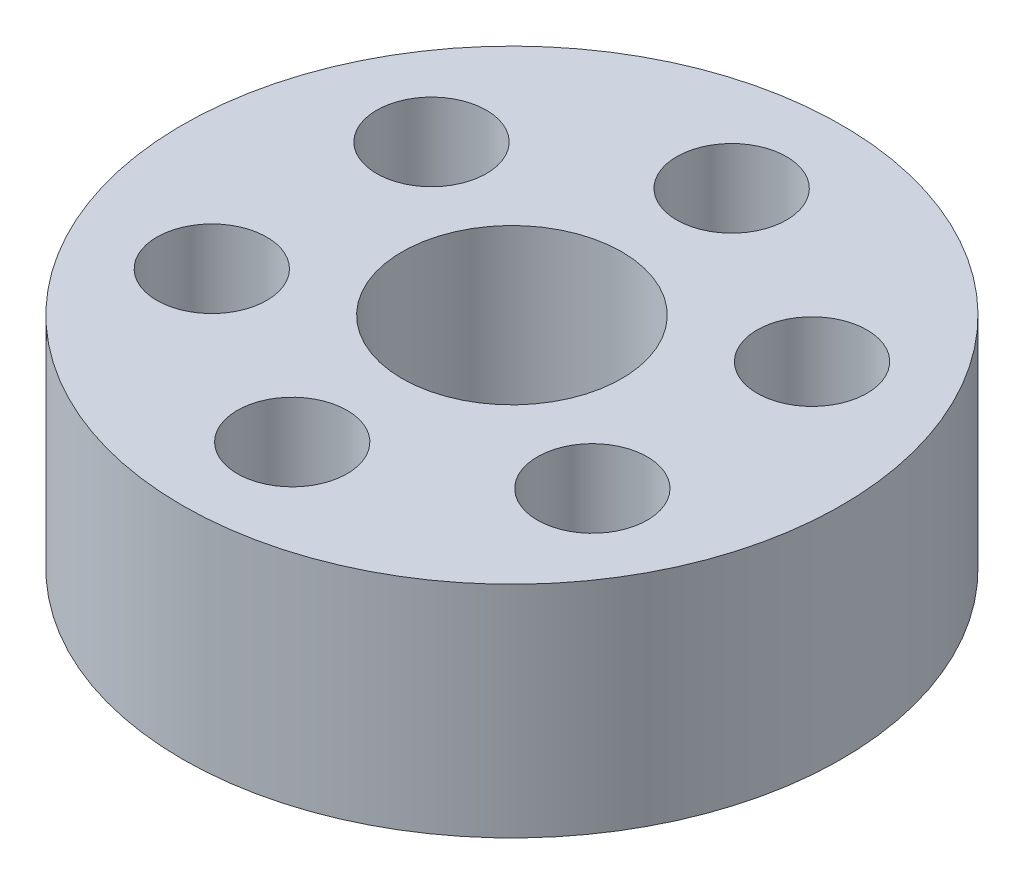
ISO-10303-21;
HEADER;
FILE_DESCRIPTION(('STEP AP214'),'2;1');
FILE_NAME('part.step','',(''),(''),'','','');
FILE_SCHEMA(('AUTOMOTIVE_DESIGN { 1 0 10303 214 1 1 1 1 }'));
ENDSEC;
DATA;
#1=APPLICATION_CONTEXT('core data for automotive mechanical design processes');
#2=APPLICATION_PROTOCOL_DEFINITION('international standard','automotive_design',2000,#1);
#3=PRODUCT_CONTEXT('',#1,'mechanical');
#4=PRODUCT('Part','Part','',(#3));
#5=PRODUCT_RELATED_PRODUCT_CATEGORY('part','',(#4));
#6=PRODUCT_DEFINITION_FORMATION('','',#4);
#7=PRODUCT_DEFINITION_CONTEXT('part definition',#1,'design');
#8=PRODUCT_DEFINITION('design','',#6,#7);
#9=PRODUCT_DEFINITION_SHAPE('','',#8);
#10=(LENGTH_UNIT() NAMED_UNIT(*) SI_UNIT(.MILLI.,.METRE.));
#11=(NAMED_UNIT(*) PLANE_ANGLE_UNIT() SI_UNIT($,.RADIAN.));
#12=(NAMED_UNIT(*) SI_UNIT($,.STERADIAN.) SOLID_ANGLE_UNIT());
#13=UNCERTAINTY_MEASURE_WITH_UNIT(LENGTH_MEASURE(1.E-05),#10,'distance_accuracy_value','');
#14=(GEOMETRIC_REPRESENTATION_CONTEXT(3) GLOBAL_UNCERTAINTY_ASSIGNED_CONTEXT((#13)) GLOBAL_UNIT_ASSIGNED_CONTEXT((#10,
#11,#12)) REPRESENTATION_CONTEXT('',''));
#15=CARTESIAN_POINT('',(0.,0.,0.));
#16=DIRECTION('',(0.,0.,1.));
#17=DIRECTION('',(1.,0.,0.));
#18=AXIS2_PLACEMENT_3D('',#15,#16,#17);
#19=CARTESIAN_POINT('',(0.,10.,0.));
#20=DIRECTION('',(0.,-1.,0.));
#21=DIRECTION('',(0.,0.,-1.));
#22=AXIS2_PLACEMENT_3D('',#19,#20,#21);
#23=CYLINDRICAL_SURFACE('',#22,15.);
#24=CARTESIAN_POINT('',(0.,10.,0.));
#25=DIRECTION('',(0.,1.,0.));
#26=DIRECTION('',(0.,0.,1.));
#27=AXIS2_PLACEMENT_3D('',#24,#25,#26);
#28=CIRCLE('',#27,15.);
#29=CARTESIAN_POINT('',(0.,10.,15.));
#30=VERTEX_POINT('',#29);
#31=EDGE_CURVE('E10',#30,#30,#28,.T.);
#32=ORIENTED_EDGE('',*,*,#31,.F.);
#33=EDGE_LOOP('',(#32));
#34=FACE_BOUND('',#33,.T.);
#35=CARTESIAN_POINT('',(0.,0.,0.));
#36=DIRECTION('',(0.,1.,0.));
#37=DIRECTION('',(0.,0.,1.));
#38=AXIS2_PLACEMENT_3D('',#35,#36,#37);
#39=CIRCLE('',#38,15.);
#40=CARTESIAN_POINT('',(0.,0.,15.));
#41=VERTEX_POINT('',#40);
#42=EDGE_CURVE('E48',#41,#41,#39,.T.);
#43=ORIENTED_EDGE('',*,*,#42,.T.);
#44=EDGE_LOOP('',(#43));
#45=FACE_BOUND('',#44,.T.);
#46=ADVANCED_FACE('F45',(#34,#45),#23,.T.);
#47=CARTESIAN_POINT('',(0.,10.,0.));
#48=DIRECTION('',(0.,1.,0.));
#49=DIRECTION('',(0.,0.,1.));
#50=AXIS2_PLACEMENT_3D('',#47,#48,#49);
#51=PLANE('',#50);
#52=CARTESIAN_POINT('',(-8.66025403784433,10.,-5.0000000000001));
#53=DIRECTION('',(0.,1.,0.));
#54=DIRECTION('',(0.866025403784433,0.,0.50000000000001));
#55=AXIS2_PLACEMENT_3D('',#52,#53,#54);
#56=CIRCLE('',#55,2.5);
#57=CARTESIAN_POINT('',(-6.49519052838325,10.,-3.75000000000008));
#58=VERTEX_POINT('',#57);
#59=EDGE_CURVE('E83',#58,#58,#56,.T.);
#60=ORIENTED_EDGE('',*,*,#59,.F.);
#61=EDGE_LOOP('',(#60));
#62=FACE_BOUND('',#61,.T.);
#63=CARTESIAN_POINT('',(-8.66025403784443,10.,4.99999999999992));
#64=DIRECTION('',(0.,1.,0.));
#65=DIRECTION('',(0.866025403784443,0.,-0.499999999999992));
#66=AXIS2_PLACEMENT_3D('',#63,#64,#65);
#67=CIRCLE('',#66,2.5);
#68=CARTESIAN_POINT('',(-6.49519052838332,10.,3.74999999999994));
#69=VERTEX_POINT('',#68);
#70=EDGE_CURVE('E91',#69,#69,#67,.T.);
#71=ORIENTED_EDGE('',*,*,#70,.F.);
#72=EDGE_LOOP('',(#71));
#73=FACE_BOUND('',#72,.T.);
#74=CARTESIAN_POINT('',(0.,10.,10.));
#75=DIRECTION('',(0.,1.,0.));
#76=DIRECTION('',(0.,0.,-1.));
#77=AXIS2_PLACEMENT_3D('',#74,#75,#76);
#78=CIRCLE('',#77,2.5);
#79=CARTESIAN_POINT('',(0.,10.,7.5));
#80=VERTEX_POINT('',#79);
#81=EDGE_CURVE('E99',#80,#80,#78,.T.);
#82=ORIENTED_EDGE('',*,*,#81,.F.);
#83=EDGE_LOOP('',(#82));
#84=FACE_BOUND('',#83,.T.);
#85=CARTESIAN_POINT('',(8.66025403784437,10.,5.00000000000004));
#86=DIRECTION('',(0.,1.,0.));
#87=DIRECTION('',(-0.866025403784436,0.,-0.500000000000004));
#88=AXIS2_PLACEMENT_3D('',#85,#86,#87);
#89=CIRCLE('',#88,2.5);
#90=CARTESIAN_POINT('',(6.49519052838327,10.,3.75000000000003));
#91=VERTEX_POINT('',#90);
#92=EDGE_CURVE('E107',#91,#91,#89,.T.);
#93=ORIENTED_EDGE('',*,*,#92,.F.);
#94=EDGE_LOOP('',(#93));
#95=FACE_BOUND('',#94,.T.);
#96=CARTESIAN_POINT('',(8.6602540378444,10.,-4.99999999999998));
#97=DIRECTION('',(0.,1.,0.));
#98=DIRECTION('',(-0.86602540378444,0.,0.499999999999998));
#99=AXIS2_PLACEMENT_3D('',#96,#97,#98);
#100=CIRCLE('',#99,2.5);
#101=CARTESIAN_POINT('',(6.4951905283833,10.,-3.74999999999998));
#102=VERTEX_POINT('',#101);
#103=EDGE_CURVE('E75',#102,#102,#100,.T.);
#104=ORIENTED_EDGE('',*,*,#103,.F.);
#105=EDGE_LOOP('',(#104));
#106=FACE_BOUND('',#105,.T.);
#107=CARTESIAN_POINT('',(0.,10.,-10.));
#108=DIRECTION('',(0.,1.,0.));
#109=DIRECTION('',(0.,0.,1.));
#110=AXIS2_PLACEMENT_3D('',#107,#108,#109);
#111=CIRCLE('',#110,2.5);
#112=CARTESIAN_POINT('',(0.,10.,-7.5));
#113=VERTEX_POINT('',#112);
#114=EDGE_CURVE('E67',#113,#113,#111,.T.);
#115=ORIENTED_EDGE('',*,*,#114,.F.);
#116=EDGE_LOOP('',(#115));
#117=FACE_BOUND('',#116,.T.);
#118=CARTESIAN_POINT('',(0.,10.,0.));
#119=DIRECTION('',(0.,1.,0.));
#120=DIRECTION('',(0.,0.,1.));
#121=AXIS2_PLACEMENT_3D('',#118,#119,#120);
#122=CIRCLE('',#121,5.);
#123=CARTESIAN_POINT('',(0.,10.,5.));
#124=VERTEX_POINT('',#123);
#125=EDGE_CURVE('E59',#124,#124,#122,.T.);
#126=ORIENTED_EDGE('',*,*,#125,.F.);
#127=EDGE_LOOP('',(#126));
#128=FACE_BOUND('',#127,.T.);
#129=ORIENTED_EDGE('',*,*,#31,.T.);
#130=EDGE_LOOP('',(#129));
#131=FACE_BOUND('',#130,.T.);
#132=ADVANCED_FACE('F126',(#62,#73,#84,#95,#106,#117,#128,#131),#51,.T.);
#133=CARTESIAN_POINT('',(0.,0.,0.));
#134=DIRECTION('',(0.,1.,0.));
#135=DIRECTION('',(0.,0.,1.));
#136=AXIS2_PLACEMENT_3D('',#133,#134,#135);
#137=PLANE('',#136);
#138=CARTESIAN_POINT('',(-8.66025403784433,0.,-5.0000000000001));
#139=DIRECTION('',(0.,1.,0.));
#140=DIRECTION('',(0.866025403784433,0.,0.50000000000001));
#141=AXIS2_PLACEMENT_3D('',#138,#139,#140);
#142=CIRCLE('',#141,2.5);
#143=CARTESIAN_POINT('',(-6.49519052838325,0.,-3.75000000000008));
#144=VERTEX_POINT('',#143);
#145=EDGE_CURVE('E87',#144,#144,#142,.T.);
#146=ORIENTED_EDGE('',*,*,#145,.T.);
#147=EDGE_LOOP('',(#146));
#148=FACE_BOUND('',#147,.T.);
#149=CARTESIAN_POINT('',(-8.66025403784443,0.,4.99999999999992));
#150=DIRECTION('',(0.,1.,0.));
#151=DIRECTION('',(0.866025403784443,0.,-0.499999999999992));
#152=AXIS2_PLACEMENT_3D('',#149,#150,#151);
#153=CIRCLE('',#152,2.5);
#154=CARTESIAN_POINT('',(-6.49519052838332,0.,3.74999999999994));
#155=VERTEX_POINT('',#154);
#156=EDGE_CURVE('E95',#155,#155,#153,.T.);
#157=ORIENTED_EDGE('',*,*,#156,.T.);
#158=EDGE_LOOP('',(#157));
#159=FACE_BOUND('',#158,.T.);
#160=CARTESIAN_POINT('',(0.,0.,10.));
#161=DIRECTION('',(0.,1.,0.));
#162=DIRECTION('',(0.,0.,-1.));
#163=AXIS2_PLACEMENT_3D('',#160,#161,#162);
#164=CIRCLE('',#163,2.5);
#165=CARTESIAN_POINT('',(0.,0.,7.5));
#166=VERTEX_POINT('',#165);
#167=EDGE_CURVE('E103',#166,#166,#164,.T.);
#168=ORIENTED_EDGE('',*,*,#167,.T.);
#169=EDGE_LOOP('',(#168));
#170=FACE_BOUND('',#169,.T.);
#171=CARTESIAN_POINT('',(8.66025403784437,0.,5.00000000000004));
#172=DIRECTION('',(0.,1.,0.));
#173=DIRECTION('',(-0.866025403784436,0.,-0.500000000000004));
#174=AXIS2_PLACEMENT_3D('',#171,#172,#173);
#175=CIRCLE('',#174,2.5);
#176=CARTESIAN_POINT('',(6.49519052838327,0.,3.75000000000003));
#177=VERTEX_POINT('',#176);
#178=EDGE_CURVE('E79',#177,#177,#175,.T.);
#179=ORIENTED_EDGE('',*,*,#178,.T.);
#180=EDGE_LOOP('',(#179));
#181=FACE_BOUND('',#180,.T.);
#182=CARTESIAN_POINT('',(8.6602540378444,0.,-4.99999999999998));
#183=DIRECTION('',(0.,1.,0.));
#184=DIRECTION('',(-0.86602540378444,0.,0.499999999999998));
#185=AXIS2_PLACEMENT_3D('',#182,#183,#184);
#186=CIRCLE('',#185,2.5);
#187=CARTESIAN_POINT('',(6.4951905283833,0.,-3.74999999999998));
#188=VERTEX_POINT('',#187);
#189=EDGE_CURVE('E71',#188,#188,#186,.T.);
#190=ORIENTED_EDGE('',*,*,#189,.T.);
#191=EDGE_LOOP('',(#190));
#192=FACE_BOUND('',#191,.T.);
#193=CARTESIAN_POINT('',(0.,0.,-10.));
#194=DIRECTION('',(0.,1.,0.));
#195=DIRECTION('',(0.,0.,1.));
#196=AXIS2_PLACEMENT_3D('',#193,#194,#195);
#197=CIRCLE('',#196,2.5);
#198=CARTESIAN_POINT('',(0.,0.,-7.5));
#199=VERTEX_POINT('',#198);
#200=EDGE_CURVE('E63',#199,#199,#197,.T.);
#201=ORIENTED_EDGE('',*,*,#200,.T.);
#202=EDGE_LOOP('',(#201));
#203=FACE_BOUND('',#202,.T.);
#204=CARTESIAN_POINT('',(0.,0.,0.));
#205=DIRECTION('',(0.,1.,0.));
#206=DIRECTION('',(0.,0.,1.));
#207=AXIS2_PLACEMENT_3D('',#204,#205,#206);
#208=CIRCLE('',#207,5.);
#209=CARTESIAN_POINT('',(0.,0.,5.));
#210=VERTEX_POINT('',#209);
#211=EDGE_CURVE('E57',#210,#210,#208,.T.);
#212=ORIENTED_EDGE('',*,*,#211,.T.);
#213=EDGE_LOOP('',(#212));
#214=FACE_BOUND('',#213,.T.);
#215=ORIENTED_EDGE('',*,*,#42,.F.);
#216=EDGE_LOOP('',(#215));
#217=FACE_BOUND('',#216,.T.);
#218=ADVANCED_FACE('F115',(#148,#159,#170,#181,#192,#203,#214,#217),#137,.F.);
#219=CARTESIAN_POINT('',(0.,0.,0.));
#220=DIRECTION('',(0.,1.,0.));
#221=DIRECTION('',(0.,0.,1.));
#222=AXIS2_PLACEMENT_3D('',#219,#220,#221);
#223=CYLINDRICAL_SURFACE('',#222,5.);
#224=ORIENTED_EDGE('',*,*,#211,.F.);
#225=EDGE_LOOP('',(#224));
#226=FACE_BOUND('',#225,.T.);
#227=ORIENTED_EDGE('',*,*,#125,.T.);
#228=EDGE_LOOP('',(#227));
#229=FACE_BOUND('',#228,.T.);
#230=ADVANCED_FACE('F137',(#226,#229),#223,.F.);
#231=CARTESIAN_POINT('',(0.,0.,-10.));
#232=DIRECTION('',(0.,1.,0.));
#233=DIRECTION('',(0.,0.,1.));
#234=AXIS2_PLACEMENT_3D('',#231,#232,#233);
#235=CYLINDRICAL_SURFACE('',#234,2.5);
#236=ORIENTED_EDGE('',*,*,#200,.F.);
#237=EDGE_LOOP('',(#236));
#238=FACE_BOUND('',#237,.T.);
#239=ORIENTED_EDGE('',*,*,#114,.T.);
#240=EDGE_LOOP('',(#239));
#241=FACE_BOUND('',#240,.T.);
#242=ADVANCED_FACE('F139',(#238,#241),#235,.F.);
#243=CARTESIAN_POINT('',(8.6602540378444,0.,-4.99999999999998));
#244=DIRECTION('',(0.,1.,0.));
#245=DIRECTION('',(0.,0.,1.));
#246=AXIS2_PLACEMENT_3D('',#243,#244,#245);
#247=CYLINDRICAL_SURFACE('',#246,2.5);
#248=ORIENTED_EDGE('',*,*,#189,.F.);
#249=EDGE_LOOP('',(#248));
#250=FACE_BOUND('',#249,.T.);
#251=ORIENTED_EDGE('',*,*,#103,.T.);
#252=EDGE_LOOP('',(#251));
#253=FACE_BOUND('',#252,.T.);
#254=ADVANCED_FACE('F122',(#250,#253),#247,.F.);
#255=CARTESIAN_POINT('',(8.66025403784437,0.,5.00000000000004));
#256=DIRECTION('',(0.,1.,0.));
#257=DIRECTION('',(0.,0.,1.));
#258=AXIS2_PLACEMENT_3D('',#255,#256,#257);
#259=CYLINDRICAL_SURFACE('',#258,2.5);
#260=ORIENTED_EDGE('',*,*,#178,.F.);
#261=EDGE_LOOP('',(#260));
#262=FACE_BOUND('',#261,.T.);
#263=ORIENTED_EDGE('',*,*,#92,.T.);
#264=EDGE_LOOP('',(#263));
#265=FACE_BOUND('',#264,.T.);
#266=ADVANCED_FACE('F118',(#262,#265),#259,.F.);
#267=CARTESIAN_POINT('',(0.,0.,10.));
#268=DIRECTION('',(0.,1.,0.));
#269=DIRECTION('',(0.,0.,1.));
#270=AXIS2_PLACEMENT_3D('',#267,#268,#269);
#271=CYLINDRICAL_SURFACE('',#270,2.5);
#272=ORIENTED_EDGE('',*,*,#167,.F.);
#273=EDGE_LOOP('',(#272));
#274=FACE_BOUND('',#273,.T.);
#275=ORIENTED_EDGE('',*,*,#81,.T.);
#276=EDGE_LOOP('',(#275));
#277=FACE_BOUND('',#276,.T.);
#278=ADVANCED_FACE('F121',(#274,#277),#271,.F.);
#279=CARTESIAN_POINT('',(-8.66025403784443,0.,4.99999999999992));
#280=DIRECTION('',(0.,1.,0.));
#281=DIRECTION('',(0.,0.,1.));
#282=AXIS2_PLACEMENT_3D('',#279,#280,#281);
#283=CYLINDRICAL_SURFACE('',#282,2.5);
#284=ORIENTED_EDGE('',*,*,#156,.F.);
#285=EDGE_LOOP('',(#284));
#286=FACE_BOUND('',#285,.T.);
#287=ORIENTED_EDGE('',*,*,#70,.T.);
#288=EDGE_LOOP('',(#287));
#289=FACE_BOUND('',#288,.T.);
#290=ADVANCED_FACE('F204',(#286,#289),#283,.F.);
#291=CARTESIAN_POINT('',(-8.66025403784433,0.,-5.0000000000001));
#292=DIRECTION('',(0.,1.,0.));
#293=DIRECTION('',(0.,0.,1.));
#294=AXIS2_PLACEMENT_3D('',#291,#292,#293);
#295=CYLINDRICAL_SURFACE('',#294,2.5);
#296=ORIENTED_EDGE('',*,*,#145,.F.);
#297=EDGE_LOOP('',(#296));
#298=FACE_BOUND('',#297,.T.);
#299=ORIENTED_EDGE('',*,*,#59,.T.);
#300=EDGE_LOOP('',(#299));
#301=FACE_BOUND('',#300,.T.);
#302=ADVANCED_FACE('F214',(#298,#301),#295,.F.);
#303=CLOSED_SHELL('',(#46,#132,#218,#230,#242,#254,#266,#278,#290,#302));
#304=MANIFOLD_SOLID_BREP('B2',#303);
#305=ADVANCED_BREP_SHAPE_REPRESENTATION('',(#18,#304),#14);
#306=SHAPE_DEFINITION_REPRESENTATION(#9,#305);
ENDSEC;
END-ISO-10303-21;
